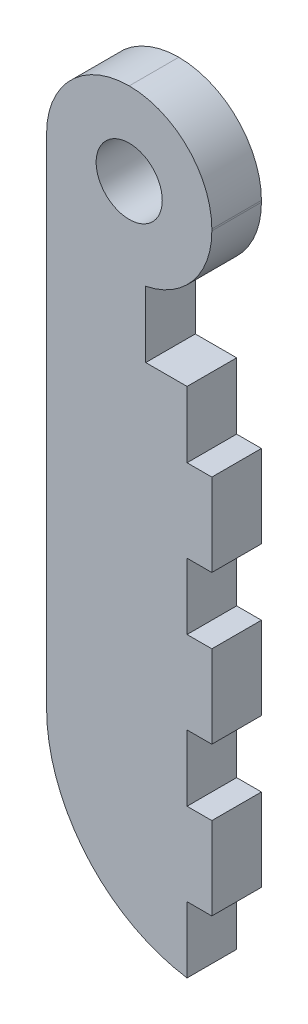
ISO-10303-21;
HEADER;
FILE_DESCRIPTION(('STEP AP214'),'2;1');
FILE_NAME('part.step','',(''),(''),'','','');
FILE_SCHEMA(('AUTOMOTIVE_DESIGN { 1 0 10303 214 1 1 1 1 }'));
ENDSEC;
DATA;
#1=APPLICATION_CONTEXT('core data for automotive mechanical design processes');
#2=APPLICATION_PROTOCOL_DEFINITION('international standard','automotive_design',2000,#1);
#3=PRODUCT_CONTEXT('',#1,'mechanical');
#4=PRODUCT('Part','Part','',(#3));
#5=PRODUCT_RELATED_PRODUCT_CATEGORY('part','',(#4));
#6=PRODUCT_DEFINITION_FORMATION('','',#4);
#7=PRODUCT_DEFINITION_CONTEXT('part definition',#1,'design');
#8=PRODUCT_DEFINITION('design','',#6,#7);
#9=PRODUCT_DEFINITION_SHAPE('','',#8);
#10=(LENGTH_UNIT() NAMED_UNIT(*) SI_UNIT(.MILLI.,.METRE.));
#11=(NAMED_UNIT(*) PLANE_ANGLE_UNIT() SI_UNIT($,.RADIAN.));
#12=(NAMED_UNIT(*) SI_UNIT($,.STERADIAN.) SOLID_ANGLE_UNIT());
#13=UNCERTAINTY_MEASURE_WITH_UNIT(LENGTH_MEASURE(1.E-05),#10,'distance_accuracy_value','');
#14=(GEOMETRIC_REPRESENTATION_CONTEXT(3) GLOBAL_UNCERTAINTY_ASSIGNED_CONTEXT((#13)) GLOBAL_UNIT_ASSIGNED_CONTEXT((#10,
#11,#12)) REPRESENTATION_CONTEXT('',''));
#15=CARTESIAN_POINT('',(0.,0.,0.));
#16=DIRECTION('',(0.,0.,1.));
#17=DIRECTION('',(1.,0.,0.));
#18=AXIS2_PLACEMENT_3D('',#15,#16,#17);
#19=CARTESIAN_POINT('',(-3.,0.,6.));
#20=DIRECTION('',(1.,0.,0.));
#21=DIRECTION('',(0.,0.,-1.));
#22=AXIS2_PLACEMENT_3D('',#19,#20,#21);
#23=PLANE('',#22);
#24=DIRECTION('',(0.,-1.,0.));
#25=VECTOR('',#24,1.);
#26=CARTESIAN_POINT('',(-3.,0.,0.));
#27=LINE('',#26,#25);
#28=CARTESIAN_POINT('',(-3.,62.,0.));
#29=VERTEX_POINT('',#28);
#30=CARTESIAN_POINT('',(-3.,54.,0.));
#31=VERTEX_POINT('',#30);
#32=EDGE_CURVE('E253',#29,#31,#27,.T.);
#33=ORIENTED_EDGE('',*,*,#32,.F.);
#34=DIRECTION('',(0.,0.,-1.));
#35=VECTOR('',#34,1.);
#36=CARTESIAN_POINT('',(-3.,62.,6.));
#37=LINE('',#36,#35);
#38=CARTESIAN_POINT('',(-3.,62.,6.));
#39=VERTEX_POINT('',#38);
#40=EDGE_CURVE('E183',#39,#29,#37,.T.);
#41=ORIENTED_EDGE('',*,*,#40,.F.);
#42=DIRECTION('',(0.,-1.,0.));
#43=VECTOR('',#42,1.);
#44=CARTESIAN_POINT('',(-3.,0.,6.));
#45=LINE('',#44,#43);
#46=CARTESIAN_POINT('',(-3.,54.,6.));
#47=VERTEX_POINT('',#46);
#48=EDGE_CURVE('E214',#39,#47,#45,.T.);
#49=ORIENTED_EDGE('',*,*,#48,.T.);
#50=DIRECTION('',(0.,0.,-1.));
#51=VECTOR('',#50,1.);
#52=CARTESIAN_POINT('',(-3.,54.,6.));
#53=LINE('',#52,#51);
#54=EDGE_CURVE('E250',#47,#31,#53,.T.);
#55=ORIENTED_EDGE('',*,*,#54,.T.);
#56=EDGE_LOOP('',(#33,#41,#49,#55));
#57=FACE_BOUND('',#56,.T.);
#58=ADVANCED_FACE('F37',(#57),#23,.T.);
#59=CARTESIAN_POINT('',(0.,0.,6.));
#60=DIRECTION('',(-1.,0.,0.));
#61=DIRECTION('',(0.,0.,1.));
#62=AXIS2_PLACEMENT_3D('',#59,#60,#61);
#63=PLANE('',#62);
#64=DIRECTION('',(0.,1.,0.));
#65=VECTOR('',#64,1.);
#66=CARTESIAN_POINT('',(0.,0.,6.));
#67=LINE('',#66,#65);
#68=CARTESIAN_POINT('',(0.,79.7979589711327,6.));
#69=VERTEX_POINT('',#68);
#70=CARTESIAN_POINT('',(0.,80.,6.));
#71=VERTEX_POINT('',#70);
#72=EDGE_CURVE('E218',#69,#71,#67,.T.);
#73=ORIENTED_EDGE('',*,*,#72,.F.);
#74=DIRECTION('',(0.,0.,1.));
#75=VECTOR('',#74,1.);
#76=CARTESIAN_POINT('',(0.,79.7979589711327,6.));
#77=LINE('',#76,#75);
#78=CARTESIAN_POINT('',(0.,79.7979589711327,0.));
#79=VERTEX_POINT('',#78);
#80=EDGE_CURVE('E336',#69,#79,#77,.F.);
#81=ORIENTED_EDGE('',*,*,#80,.T.);
#82=DIRECTION('',(0.,1.,0.));
#83=VECTOR('',#82,1.);
#84=CARTESIAN_POINT('',(0.,0.,0.));
#85=LINE('',#84,#83);
#86=CARTESIAN_POINT('',(0.,80.,0.));
#87=VERTEX_POINT('',#86);
#88=EDGE_CURVE('E255',#79,#87,#85,.T.);
#89=ORIENTED_EDGE('',*,*,#88,.T.);
#90=DIRECTION('',(0.,0.,-1.));
#91=VECTOR('',#90,1.);
#92=CARTESIAN_POINT('',(0.,80.,6.));
#93=LINE('',#92,#91);
#94=EDGE_CURVE('E334',#87,#71,#93,.F.);
#95=ORIENTED_EDGE('',*,*,#94,.T.);
#96=EDGE_LOOP('',(#73,#81,#89,#95));
#97=FACE_BOUND('',#96,.T.);
#98=ADVANCED_FACE('F353',(#97),#63,.F.);
#99=CARTESIAN_POINT('',(-20.,0.,6.));
#100=DIRECTION('',(-1.,0.,0.));
#101=DIRECTION('',(0.,0.,1.));
#102=AXIS2_PLACEMENT_3D('',#99,#100,#101);
#103=PLANE('',#102);
#104=DIRECTION('',(0.,1.,0.));
#105=VECTOR('',#104,1.);
#106=CARTESIAN_POINT('',(-20.,0.,0.));
#107=LINE('',#106,#105);
#108=CARTESIAN_POINT('',(-20.,19.7737199332852,0.));
#109=VERTEX_POINT('',#108);
#110=CARTESIAN_POINT('',(-20.,80.,0.));
#111=VERTEX_POINT('',#110);
#112=EDGE_CURVE('E260',#109,#111,#107,.T.);
#113=ORIENTED_EDGE('',*,*,#112,.F.);
#114=DIRECTION('',(0.,0.,-1.));
#115=VECTOR('',#114,1.);
#116=CARTESIAN_POINT('',(-20.,19.7737199332852,6.));
#117=LINE('',#116,#115);
#118=CARTESIAN_POINT('',(-20.,19.7737199332852,6.));
#119=VERTEX_POINT('',#118);
#120=EDGE_CURVE('E45',#109,#119,#117,.F.);
#121=ORIENTED_EDGE('',*,*,#120,.T.);
#122=DIRECTION('',(0.,1.,0.));
#123=VECTOR('',#122,1.);
#124=CARTESIAN_POINT('',(-20.,0.,6.));
#125=LINE('',#124,#123);
#126=CARTESIAN_POINT('',(-20.,80.,6.));
#127=VERTEX_POINT('',#126);
#128=EDGE_CURVE('E223',#119,#127,#125,.T.);
#129=ORIENTED_EDGE('',*,*,#128,.T.);
#130=DIRECTION('',(0.,0.,-1.));
#131=VECTOR('',#130,1.);
#132=CARTESIAN_POINT('',(-20.,80.,0.));
#133=LINE('',#132,#131);
#134=EDGE_CURVE('E319',#127,#111,#133,.T.);
#135=ORIENTED_EDGE('',*,*,#134,.T.);
#136=EDGE_LOOP('',(#113,#121,#129,#135));
#137=FACE_BOUND('',#136,.T.);
#138=ADVANCED_FACE('F391',(#137),#103,.T.);
#139=CARTESIAN_POINT('',(-3.,8.,0.));
#140=VERTEX_POINT('',#139);
#141=CARTESIAN_POINT('',(-3.,0.,0.));
#142=VERTEX_POINT('',#141);
#143=EDGE_CURVE('E257',#140,#142,#27,.T.);
#144=ORIENTED_EDGE('',*,*,#143,.F.);
#145=DIRECTION('',(0.,0.,-1.));
#146=VECTOR('',#145,1.);
#147=CARTESIAN_POINT('',(-3.,8.,6.));
#148=LINE('',#147,#146);
#149=CARTESIAN_POINT('',(-3.,8.,6.));
#150=VERTEX_POINT('',#149);
#151=EDGE_CURVE('E313',#150,#140,#148,.T.);
#152=ORIENTED_EDGE('',*,*,#151,.F.);
#153=CARTESIAN_POINT('',(-3.,0.,6.));
#154=VERTEX_POINT('',#153);
#155=EDGE_CURVE('E220',#150,#154,#45,.T.);
#156=ORIENTED_EDGE('',*,*,#155,.T.);
#157=DIRECTION('',(0.,0.,-1.));
#158=VECTOR('',#157,1.);
#159=CARTESIAN_POINT('',(-3.,0.,6.));
#160=LINE('',#159,#158);
#161=EDGE_CURVE('E315',#154,#142,#160,.T.);
#162=ORIENTED_EDGE('',*,*,#161,.T.);
#163=EDGE_LOOP('',(#144,#152,#156,#162));
#164=FACE_BOUND('',#163,.T.);
#165=ADVANCED_FACE('F384',(#164),#23,.T.);
#166=CARTESIAN_POINT('',(0.,8.,6.));
#167=DIRECTION('',(0.,-1.,0.));
#168=DIRECTION('',(0.,0.,-1.));
#169=AXIS2_PLACEMENT_3D('',#166,#167,#168);
#170=PLANE('',#169);
#171=DIRECTION('',(-1.,0.,0.));
#172=VECTOR('',#171,1.);
#173=CARTESIAN_POINT('',(0.,8.,0.));
#174=LINE('',#173,#172);
#175=CARTESIAN_POINT('',(0.,8.,0.));
#176=VERTEX_POINT('',#175);
#177=EDGE_CURVE('E262',#176,#140,#174,.T.);
#178=ORIENTED_EDGE('',*,*,#177,.F.);
#179=DIRECTION('',(0.,0.,-1.));
#180=VECTOR('',#179,1.);
#181=CARTESIAN_POINT('',(0.,8.,6.));
#182=LINE('',#181,#180);
#183=CARTESIAN_POINT('',(0.,8.,6.));
#184=VERTEX_POINT('',#183);
#185=EDGE_CURVE('E311',#184,#176,#182,.T.);
#186=ORIENTED_EDGE('',*,*,#185,.F.);
#187=DIRECTION('',(-1.,0.,0.));
#188=VECTOR('',#187,1.);
#189=CARTESIAN_POINT('',(0.,8.,6.));
#190=LINE('',#189,#188);
#191=EDGE_CURVE('E225',#184,#150,#190,.T.);
#192=ORIENTED_EDGE('',*,*,#191,.T.);
#193=ORIENTED_EDGE('',*,*,#151,.T.);
#194=EDGE_LOOP('',(#178,#186,#192,#193));
#195=FACE_BOUND('',#194,.T.);
#196=ADVANCED_FACE('F398',(#195),#170,.T.);
#197=CARTESIAN_POINT('',(0.,0.,6.));
#198=DIRECTION('',(-1.,0.,0.));
#199=DIRECTION('',(0.,0.,1.));
#200=AXIS2_PLACEMENT_3D('',#197,#198,#199);
#201=PLANE('',#200);
#202=DIRECTION('',(0.,1.,0.));
#203=VECTOR('',#202,1.);
#204=CARTESIAN_POINT('',(0.,0.,0.));
#205=LINE('',#204,#203);
#206=CARTESIAN_POINT('',(0.,18.,0.));
#207=VERTEX_POINT('',#206);
#208=EDGE_CURVE('E265',#176,#207,#205,.T.);
#209=ORIENTED_EDGE('',*,*,#208,.T.);
#210=DIRECTION('',(0.,0.,-1.));
#211=VECTOR('',#210,1.);
#212=CARTESIAN_POINT('',(0.,18.,6.));
#213=LINE('',#212,#211);
#214=CARTESIAN_POINT('',(0.,18.,6.));
#215=VERTEX_POINT('',#214);
#216=EDGE_CURVE('E308',#215,#207,#213,.T.);
#217=ORIENTED_EDGE('',*,*,#216,.F.);
#218=DIRECTION('',(0.,1.,0.));
#219=VECTOR('',#218,1.);
#220=CARTESIAN_POINT('',(0.,0.,6.));
#221=LINE('',#220,#219);
#222=EDGE_CURVE('E228',#184,#215,#221,.T.);
#223=ORIENTED_EDGE('',*,*,#222,.F.);
#224=ORIENTED_EDGE('',*,*,#185,.T.);
#225=EDGE_LOOP('',(#209,#217,#223,#224));
#226=FACE_BOUND('',#225,.T.);
#227=ADVANCED_FACE('F427',(#226),#201,.F.);
#228=CARTESIAN_POINT('',(0.,18.,6.));
#229=DIRECTION('',(0.,-1.,0.));
#230=DIRECTION('',(0.,0.,-1.));
#231=AXIS2_PLACEMENT_3D('',#228,#229,#230);
#232=PLANE('',#231);
#233=DIRECTION('',(-1.,0.,0.));
#234=VECTOR('',#233,1.);
#235=CARTESIAN_POINT('',(0.,18.,0.));
#236=LINE('',#235,#234);
#237=CARTESIAN_POINT('',(-3.,18.,0.));
#238=VERTEX_POINT('',#237);
#239=EDGE_CURVE('E268',#207,#238,#236,.T.);
#240=ORIENTED_EDGE('',*,*,#239,.T.);
#241=DIRECTION('',(0.,0.,-1.));
#242=VECTOR('',#241,1.);
#243=CARTESIAN_POINT('',(-3.,18.,6.));
#244=LINE('',#243,#242);
#245=CARTESIAN_POINT('',(-3.,18.,6.));
#246=VERTEX_POINT('',#245);
#247=EDGE_CURVE('E306',#246,#238,#244,.T.);
#248=ORIENTED_EDGE('',*,*,#247,.F.);
#249=DIRECTION('',(-1.,0.,0.));
#250=VECTOR('',#249,1.);
#251=CARTESIAN_POINT('',(0.,18.,6.));
#252=LINE('',#251,#250);
#253=EDGE_CURVE('E231',#215,#246,#252,.T.);
#254=ORIENTED_EDGE('',*,*,#253,.F.);
#255=ORIENTED_EDGE('',*,*,#216,.T.);
#256=EDGE_LOOP('',(#240,#248,#254,#255));
#257=FACE_BOUND('',#256,.T.);
#258=ADVANCED_FACE('F419',(#257),#232,.F.);
#259=CARTESIAN_POINT('',(-3.,26.,0.));
#260=VERTEX_POINT('',#259);
#261=EDGE_CURVE('E271',#260,#238,#27,.T.);
#262=ORIENTED_EDGE('',*,*,#261,.F.);
#263=DIRECTION('',(0.,0.,-1.));
#264=VECTOR('',#263,1.);
#265=CARTESIAN_POINT('',(-3.,26.,6.));
#266=LINE('',#265,#264);
#267=CARTESIAN_POINT('',(-3.,26.,6.));
#268=VERTEX_POINT('',#267);
#269=EDGE_CURVE('E304',#268,#260,#266,.T.);
#270=ORIENTED_EDGE('',*,*,#269,.F.);
#271=EDGE_CURVE('E233',#268,#246,#45,.T.);
#272=ORIENTED_EDGE('',*,*,#271,.T.);
#273=ORIENTED_EDGE('',*,*,#247,.T.);
#274=EDGE_LOOP('',(#262,#270,#272,#273));
#275=FACE_BOUND('',#274,.T.);
#276=ADVANCED_FACE('F400',(#275),#23,.T.);
#277=CARTESIAN_POINT('',(0.,26.,6.));
#278=DIRECTION('',(0.,-1.,0.));
#279=DIRECTION('',(0.,0.,-1.));
#280=AXIS2_PLACEMENT_3D('',#277,#278,#279);
#281=PLANE('',#280);
#282=DIRECTION('',(-1.,0.,0.));
#283=VECTOR('',#282,1.);
#284=CARTESIAN_POINT('',(0.,26.,0.));
#285=LINE('',#284,#283);
#286=CARTESIAN_POINT('',(0.,26.,0.));
#287=VERTEX_POINT('',#286);
#288=EDGE_CURVE('E272',#287,#260,#285,.T.);
#289=ORIENTED_EDGE('',*,*,#288,.F.);
#290=DIRECTION('',(0.,0.,-1.));
#291=VECTOR('',#290,1.);
#292=CARTESIAN_POINT('',(0.,26.,6.));
#293=LINE('',#292,#291);
#294=CARTESIAN_POINT('',(0.,26.,6.));
#295=VERTEX_POINT('',#294);
#296=EDGE_CURVE('E302',#295,#287,#293,.T.);
#297=ORIENTED_EDGE('',*,*,#296,.F.);
#298=DIRECTION('',(-1.,0.,0.));
#299=VECTOR('',#298,1.);
#300=CARTESIAN_POINT('',(0.,26.,6.));
#301=LINE('',#300,#299);
#302=EDGE_CURVE('E234',#295,#268,#301,.T.);
#303=ORIENTED_EDGE('',*,*,#302,.T.);
#304=ORIENTED_EDGE('',*,*,#269,.T.);
#305=EDGE_LOOP('',(#289,#297,#303,#304));
#306=FACE_BOUND('',#305,.T.);
#307=ADVANCED_FACE('F418',(#306),#281,.T.);
#308=CARTESIAN_POINT('',(0.,0.,6.));
#309=DIRECTION('',(-1.,0.,0.));
#310=DIRECTION('',(0.,0.,1.));
#311=AXIS2_PLACEMENT_3D('',#308,#309,#310);
#312=PLANE('',#311);
#313=DIRECTION('',(0.,1.,0.));
#314=VECTOR('',#313,1.);
#315=CARTESIAN_POINT('',(0.,0.,0.));
#316=LINE('',#315,#314);
#317=CARTESIAN_POINT('',(0.,36.,0.));
#318=VERTEX_POINT('',#317);
#319=EDGE_CURVE('E275',#287,#318,#316,.T.);
#320=ORIENTED_EDGE('',*,*,#319,.T.);
#321=DIRECTION('',(0.,0.,-1.));
#322=VECTOR('',#321,1.);
#323=CARTESIAN_POINT('',(0.,36.,6.));
#324=LINE('',#323,#322);
#325=CARTESIAN_POINT('',(0.,36.,6.));
#326=VERTEX_POINT('',#325);
#327=EDGE_CURVE('E299',#326,#318,#324,.T.);
#328=ORIENTED_EDGE('',*,*,#327,.F.);
#329=DIRECTION('',(0.,1.,0.));
#330=VECTOR('',#329,1.);
#331=CARTESIAN_POINT('',(0.,0.,6.));
#332=LINE('',#331,#330);
#333=EDGE_CURVE('E237',#295,#326,#332,.T.);
#334=ORIENTED_EDGE('',*,*,#333,.F.);
#335=ORIENTED_EDGE('',*,*,#296,.T.);
#336=EDGE_LOOP('',(#320,#328,#334,#335));
#337=FACE_BOUND('',#336,.T.);
#338=ADVANCED_FACE('F415',(#337),#312,.F.);
#339=CARTESIAN_POINT('',(0.,36.,6.));
#340=DIRECTION('',(0.,-1.,0.));
#341=DIRECTION('',(0.,0.,-1.));
#342=AXIS2_PLACEMENT_3D('',#339,#340,#341);
#343=PLANE('',#342);
#344=DIRECTION('',(-1.,0.,0.));
#345=VECTOR('',#344,1.);
#346=CARTESIAN_POINT('',(0.,36.,0.));
#347=LINE('',#346,#345);
#348=CARTESIAN_POINT('',(-3.,36.,0.));
#349=VERTEX_POINT('',#348);
#350=EDGE_CURVE('E278',#318,#349,#347,.T.);
#351=ORIENTED_EDGE('',*,*,#350,.T.);
#352=DIRECTION('',(0.,0.,-1.));
#353=VECTOR('',#352,1.);
#354=CARTESIAN_POINT('',(-3.,36.,6.));
#355=LINE('',#354,#353);
#356=CARTESIAN_POINT('',(-3.,36.,6.));
#357=VERTEX_POINT('',#356);
#358=EDGE_CURVE('E297',#357,#349,#355,.T.);
#359=ORIENTED_EDGE('',*,*,#358,.F.);
#360=DIRECTION('',(-1.,0.,0.));
#361=VECTOR('',#360,1.);
#362=CARTESIAN_POINT('',(0.,36.,6.));
#363=LINE('',#362,#361);
#364=EDGE_CURVE('E240',#326,#357,#363,.T.);
#365=ORIENTED_EDGE('',*,*,#364,.F.);
#366=ORIENTED_EDGE('',*,*,#327,.T.);
#367=EDGE_LOOP('',(#351,#359,#365,#366));
#368=FACE_BOUND('',#367,.T.);
#369=ADVANCED_FACE('F410',(#368),#343,.F.);
#370=CARTESIAN_POINT('',(-3.,44.,0.));
#371=VERTEX_POINT('',#370);
#372=EDGE_CURVE('E256',#371,#349,#27,.T.);
#373=ORIENTED_EDGE('',*,*,#372,.F.);
#374=DIRECTION('',(0.,0.,-1.));
#375=VECTOR('',#374,1.);
#376=CARTESIAN_POINT('',(-3.,44.,6.));
#377=LINE('',#376,#375);
#378=CARTESIAN_POINT('',(-3.,44.,6.));
#379=VERTEX_POINT('',#378);
#380=EDGE_CURVE('E295',#379,#371,#377,.T.);
#381=ORIENTED_EDGE('',*,*,#380,.F.);
#382=EDGE_CURVE('E219',#379,#357,#45,.T.);
#383=ORIENTED_EDGE('',*,*,#382,.T.);
#384=ORIENTED_EDGE('',*,*,#358,.T.);
#385=EDGE_LOOP('',(#373,#381,#383,#384));
#386=FACE_BOUND('',#385,.T.);
#387=ADVANCED_FACE('F404',(#386),#23,.T.);
#388=CARTESIAN_POINT('',(0.,44.,6.));
#389=DIRECTION('',(0.,-1.,0.));
#390=DIRECTION('',(0.,0.,-1.));
#391=AXIS2_PLACEMENT_3D('',#388,#389,#390);
#392=PLANE('',#391);
#393=DIRECTION('',(-1.,0.,0.));
#394=VECTOR('',#393,1.);
#395=CARTESIAN_POINT('',(0.,44.,0.));
#396=LINE('',#395,#394);
#397=CARTESIAN_POINT('',(0.,44.,0.));
#398=VERTEX_POINT('',#397);
#399=EDGE_CURVE('E281',#398,#371,#396,.T.);
#400=ORIENTED_EDGE('',*,*,#399,.F.);
#401=DIRECTION('',(0.,0.,-1.));
#402=VECTOR('',#401,1.);
#403=CARTESIAN_POINT('',(0.,44.,6.));
#404=LINE('',#403,#402);
#405=CARTESIAN_POINT('',(0.,44.,6.));
#406=VERTEX_POINT('',#405);
#407=EDGE_CURVE('E293',#406,#398,#404,.T.);
#408=ORIENTED_EDGE('',*,*,#407,.F.);
#409=DIRECTION('',(-1.,0.,0.));
#410=VECTOR('',#409,1.);
#411=CARTESIAN_POINT('',(0.,44.,6.));
#412=LINE('',#411,#410);
#413=EDGE_CURVE('E242',#406,#379,#412,.T.);
#414=ORIENTED_EDGE('',*,*,#413,.T.);
#415=ORIENTED_EDGE('',*,*,#380,.T.);
#416=EDGE_LOOP('',(#400,#408,#414,#415));
#417=FACE_BOUND('',#416,.T.);
#418=ADVANCED_FACE('F373',(#417),#392,.T.);
#419=CARTESIAN_POINT('',(0.,0.,6.));
#420=DIRECTION('',(-1.,0.,0.));
#421=DIRECTION('',(0.,0.,1.));
#422=AXIS2_PLACEMENT_3D('',#419,#420,#421);
#423=PLANE('',#422);
#424=DIRECTION('',(0.,1.,0.));
#425=VECTOR('',#424,1.);
#426=CARTESIAN_POINT('',(0.,0.,0.));
#427=LINE('',#426,#425);
#428=CARTESIAN_POINT('',(0.,54.,0.));
#429=VERTEX_POINT('',#428);
#430=EDGE_CURVE('E284',#398,#429,#427,.T.);
#431=ORIENTED_EDGE('',*,*,#430,.T.);
#432=DIRECTION('',(0.,0.,-1.));
#433=VECTOR('',#432,1.);
#434=CARTESIAN_POINT('',(0.,54.,6.));
#435=LINE('',#434,#433);
#436=CARTESIAN_POINT('',(0.,54.,6.));
#437=VERTEX_POINT('',#436);
#438=EDGE_CURVE('E290',#437,#429,#435,.T.);
#439=ORIENTED_EDGE('',*,*,#438,.F.);
#440=DIRECTION('',(0.,1.,0.));
#441=VECTOR('',#440,1.);
#442=CARTESIAN_POINT('',(0.,0.,6.));
#443=LINE('',#442,#441);
#444=EDGE_CURVE('E245',#406,#437,#443,.T.);
#445=ORIENTED_EDGE('',*,*,#444,.F.);
#446=ORIENTED_EDGE('',*,*,#407,.T.);
#447=EDGE_LOOP('',(#431,#439,#445,#446));
#448=FACE_BOUND('',#447,.T.);
#449=ADVANCED_FACE('F370',(#448),#423,.F.);
#450=CARTESIAN_POINT('',(-10.,80.,6.));
#451=DIRECTION('',(0.,0.,-1.));
#452=DIRECTION('',(-1.,0.,0.));
#453=AXIS2_PLACEMENT_3D('',#450,#451,#452);
#454=CYLINDRICAL_SURFACE('',#453,4.);
#455=CARTESIAN_POINT('',(-10.,80.,6.));
#456=DIRECTION('',(0.,0.,1.));
#457=DIRECTION('',(1.,0.,0.));
#458=AXIS2_PLACEMENT_3D('',#455,#456,#457);
#459=CIRCLE('',#458,4.);
#460=CARTESIAN_POINT('',(-6.,80.,6.));
#461=VERTEX_POINT('',#460);
#462=EDGE_CURVE('E211',#461,#461,#459,.T.);
#463=ORIENTED_EDGE('',*,*,#462,.T.);
#464=EDGE_LOOP('',(#463));
#465=FACE_BOUND('',#464,.T.);
#466=CARTESIAN_POINT('',(-10.,80.,0.));
#467=DIRECTION('',(0.,0.,1.));
#468=DIRECTION('',(1.,0.,0.));
#469=AXIS2_PLACEMENT_3D('',#466,#467,#468);
#470=CIRCLE('',#469,4.);
#471=CARTESIAN_POINT('',(-6.,80.,0.));
#472=VERTEX_POINT('',#471);
#473=EDGE_CURVE('E198',#472,#472,#470,.T.);
#474=ORIENTED_EDGE('',*,*,#473,.F.);
#475=EDGE_LOOP('',(#474));
#476=FACE_BOUND('',#475,.T.);
#477=ADVANCED_FACE('F507',(#465,#476),#454,.F.);
#478=CARTESIAN_POINT('',(0.,54.,6.));
#479=DIRECTION('',(0.,-1.,0.));
#480=DIRECTION('',(0.,0.,-1.));
#481=AXIS2_PLACEMENT_3D('',#478,#479,#480);
#482=PLANE('',#481);
#483=DIRECTION('',(-1.,0.,0.));
#484=VECTOR('',#483,1.);
#485=CARTESIAN_POINT('',(0.,54.,0.));
#486=LINE('',#485,#484);
#487=EDGE_CURVE('E215',#429,#31,#486,.T.);
#488=ORIENTED_EDGE('',*,*,#487,.T.);
#489=ORIENTED_EDGE('',*,*,#54,.F.);
#490=DIRECTION('',(-1.,0.,0.));
#491=VECTOR('',#490,1.);
#492=CARTESIAN_POINT('',(0.,54.,6.));
#493=LINE('',#492,#491);
#494=EDGE_CURVE('E248',#437,#47,#493,.T.);
#495=ORIENTED_EDGE('',*,*,#494,.F.);
#496=ORIENTED_EDGE('',*,*,#438,.T.);
#497=EDGE_LOOP('',(#488,#489,#495,#496));
#498=FACE_BOUND('',#497,.T.);
#499=ADVANCED_FACE('F367',(#498),#482,.F.);
#500=CARTESIAN_POINT('',(0.,0.,6.));
#501=DIRECTION('',(0.,0.,1.));
#502=DIRECTION('',(1.,0.,0.));
#503=AXIS2_PLACEMENT_3D('',#500,#501,#502);
#504=PLANE('',#503);
#505=ORIENTED_EDGE('',*,*,#128,.F.);
#506=CARTESIAN_POINT('',(0.,19.7737199332852,6.));
#507=DIRECTION('',(0.,0.,1.));
#508=DIRECTION('',(1.,0.,0.));
#509=AXIS2_PLACEMENT_3D('',#506,#507,#508);
#510=CIRCLE('',#509,20.);
#511=EDGE_CURVE('E11',#119,#154,#510,.T.);
#512=ORIENTED_EDGE('',*,*,#511,.T.);
#513=ORIENTED_EDGE('',*,*,#155,.F.);
#514=ORIENTED_EDGE('',*,*,#191,.F.);
#515=ORIENTED_EDGE('',*,*,#222,.T.);
#516=ORIENTED_EDGE('',*,*,#253,.T.);
#517=ORIENTED_EDGE('',*,*,#271,.F.);
#518=ORIENTED_EDGE('',*,*,#302,.F.);
#519=ORIENTED_EDGE('',*,*,#333,.T.);
#520=ORIENTED_EDGE('',*,*,#364,.T.);
#521=ORIENTED_EDGE('',*,*,#382,.F.);
#522=ORIENTED_EDGE('',*,*,#413,.F.);
#523=ORIENTED_EDGE('',*,*,#444,.T.);
#524=ORIENTED_EDGE('',*,*,#494,.T.);
#525=ORIENTED_EDGE('',*,*,#48,.F.);
#526=DIRECTION('',(1.,0.,0.));
#527=VECTOR('',#526,1.);
#528=CARTESIAN_POINT('',(-3.,62.,6.));
#529=LINE('',#528,#527);
#530=CARTESIAN_POINT('',(-8.,62.,6.));
#531=VERTEX_POINT('',#530);
#532=EDGE_CURVE('E188',#531,#39,#529,.T.);
#533=ORIENTED_EDGE('',*,*,#532,.F.);
#534=DIRECTION('',(0.,-1.,0.));
#535=VECTOR('',#534,1.);
#536=CARTESIAN_POINT('',(-8.,62.,6.));
#537=LINE('',#536,#535);
#538=CARTESIAN_POINT('',(-8.,70.,6.));
#539=VERTEX_POINT('',#538);
#540=EDGE_CURVE('E196',#539,#531,#537,.T.);
#541=ORIENTED_EDGE('',*,*,#540,.F.);
#542=CARTESIAN_POINT('',(-10.,79.7979589711327,6.));
#543=DIRECTION('',(0.,0.,1.));
#544=DIRECTION('',(1.,0.,0.));
#545=AXIS2_PLACEMENT_3D('',#542,#543,#544);
#546=CIRCLE('',#545,10.);
#547=EDGE_CURVE('E332',#539,#69,#546,.T.);
#548=ORIENTED_EDGE('',*,*,#547,.T.);
#549=ORIENTED_EDGE('',*,*,#72,.T.);
#550=CARTESIAN_POINT('',(-10.,80.,6.));
#551=DIRECTION('',(0.,0.,1.));
#552=DIRECTION('',(1.,0.,0.));
#553=AXIS2_PLACEMENT_3D('',#550,#551,#552);
#554=CIRCLE('',#553,10.);
#555=CARTESIAN_POINT('',(-10.,90.,6.));
#556=VERTEX_POINT('',#555);
#557=EDGE_CURVE('E327',#71,#556,#554,.T.);
#558=ORIENTED_EDGE('',*,*,#557,.T.);
#559=CARTESIAN_POINT('',(-10.,80.,6.));
#560=DIRECTION('',(0.,0.,1.));
#561=DIRECTION('',(1.,0.,0.));
#562=AXIS2_PLACEMENT_3D('',#559,#560,#561);
#563=CIRCLE('',#562,10.);
#564=EDGE_CURVE('E329',#556,#127,#563,.T.);
#565=ORIENTED_EDGE('',*,*,#564,.T.);
#566=EDGE_LOOP('',(#505,#512,#513,#514,#515,#516,#517,#518,#519,#520,#521,#522,#523,#524,#525,
#533,#541,#548,#549,#558,#565));
#567=FACE_BOUND('',#566,.T.);
#568=ORIENTED_EDGE('',*,*,#462,.F.);
#569=EDGE_LOOP('',(#568));
#570=FACE_BOUND('',#569,.T.);
#571=ADVANCED_FACE('F358',(#567,#570),#504,.T.);
#572=CARTESIAN_POINT('',(0.,0.,0.));
#573=DIRECTION('',(0.,0.,1.));
#574=DIRECTION('',(1.,0.,0.));
#575=AXIS2_PLACEMENT_3D('',#572,#573,#574);
#576=PLANE('',#575);
#577=ORIENTED_EDGE('',*,*,#473,.T.);
#578=EDGE_LOOP('',(#577));
#579=FACE_BOUND('',#578,.T.);
#580=ORIENTED_EDGE('',*,*,#143,.T.);
#581=CARTESIAN_POINT('',(0.,19.7737199332852,0.));
#582=DIRECTION('',(0.,0.,1.));
#583=DIRECTION('',(1.,0.,0.));
#584=AXIS2_PLACEMENT_3D('',#581,#582,#583);
#585=CIRCLE('',#584,20.);
#586=EDGE_CURVE('E59',#142,#109,#585,.F.);
#587=ORIENTED_EDGE('',*,*,#586,.T.);
#588=ORIENTED_EDGE('',*,*,#112,.T.);
#589=CARTESIAN_POINT('',(-10.,80.,0.));
#590=DIRECTION('',(0.,0.,1.));
#591=DIRECTION('',(1.,0.,0.));
#592=AXIS2_PLACEMENT_3D('',#589,#590,#591);
#593=CIRCLE('',#592,10.);
#594=CARTESIAN_POINT('',(-10.,90.,0.));
#595=VERTEX_POINT('',#594);
#596=EDGE_CURVE('E324',#111,#595,#593,.F.);
#597=ORIENTED_EDGE('',*,*,#596,.T.);
#598=CARTESIAN_POINT('',(-10.,80.,0.));
#599=DIRECTION('',(0.,0.,1.));
#600=DIRECTION('',(1.,0.,0.));
#601=AXIS2_PLACEMENT_3D('',#598,#599,#600);
#602=CIRCLE('',#601,10.);
#603=EDGE_CURVE('E322',#595,#87,#602,.F.);
#604=ORIENTED_EDGE('',*,*,#603,.T.);
#605=ORIENTED_EDGE('',*,*,#88,.F.);
#606=CARTESIAN_POINT('',(-10.,79.7979589711327,0.));
#607=DIRECTION('',(0.,0.,1.));
#608=DIRECTION('',(1.,0.,0.));
#609=AXIS2_PLACEMENT_3D('',#606,#607,#608);
#610=CIRCLE('',#609,10.);
#611=CARTESIAN_POINT('',(-8.,70.,0.));
#612=VERTEX_POINT('',#611);
#613=EDGE_CURVE('E204',#79,#612,#610,.F.);
#614=ORIENTED_EDGE('',*,*,#613,.T.);
#615=DIRECTION('',(0.,-1.,0.));
#616=VECTOR('',#615,1.);
#617=CARTESIAN_POINT('',(-8.,62.,0.));
#618=LINE('',#617,#616);
#619=CARTESIAN_POINT('',(-8.,62.,0.));
#620=VERTEX_POINT('',#619);
#621=EDGE_CURVE('E187',#612,#620,#618,.T.);
#622=ORIENTED_EDGE('',*,*,#621,.T.);
#623=DIRECTION('',(1.,0.,0.));
#624=VECTOR('',#623,1.);
#625=CARTESIAN_POINT('',(0.,62.,0.));
#626=LINE('',#625,#624);
#627=EDGE_CURVE('E177',#620,#29,#626,.T.);
#628=ORIENTED_EDGE('',*,*,#627,.T.);
#629=ORIENTED_EDGE('',*,*,#32,.T.);
#630=ORIENTED_EDGE('',*,*,#487,.F.);
#631=ORIENTED_EDGE('',*,*,#430,.F.);
#632=ORIENTED_EDGE('',*,*,#399,.T.);
#633=ORIENTED_EDGE('',*,*,#372,.T.);
#634=ORIENTED_EDGE('',*,*,#350,.F.);
#635=ORIENTED_EDGE('',*,*,#319,.F.);
#636=ORIENTED_EDGE('',*,*,#288,.T.);
#637=ORIENTED_EDGE('',*,*,#261,.T.);
#638=ORIENTED_EDGE('',*,*,#239,.F.);
#639=ORIENTED_EDGE('',*,*,#208,.F.);
#640=ORIENTED_EDGE('',*,*,#177,.T.);
#641=EDGE_LOOP('',(#580,#587,#588,#597,#604,#605,#614,#622,#628,#629,#630,#631,#632,#633,#634,
#635,#636,#637,#638,#639,#640));
#642=FACE_BOUND('',#641,.T.);
#643=ADVANCED_FACE('F201',(#579,#642),#576,.F.);
#644=CARTESIAN_POINT('',(-3.,62.,0.));
#645=DIRECTION('',(0.,-1.,0.));
#646=DIRECTION('',(0.,0.,-1.));
#647=AXIS2_PLACEMENT_3D('',#644,#645,#646);
#648=PLANE('',#647);
#649=ORIENTED_EDGE('',*,*,#40,.T.);
#650=ORIENTED_EDGE('',*,*,#627,.F.);
#651=DIRECTION('',(0.,0.,1.));
#652=VECTOR('',#651,1.);
#653=CARTESIAN_POINT('',(-8.,62.,0.));
#654=LINE('',#653,#652);
#655=EDGE_CURVE('E180',#620,#531,#654,.T.);
#656=ORIENTED_EDGE('',*,*,#655,.T.);
#657=ORIENTED_EDGE('',*,*,#532,.T.);
#658=EDGE_LOOP('',(#649,#650,#656,#657));
#659=FACE_BOUND('',#658,.T.);
#660=ADVANCED_FACE('F179',(#659),#648,.F.);
#661=CARTESIAN_POINT('',(-8.,62.,0.));
#662=DIRECTION('',(-1.,0.,0.));
#663=DIRECTION('',(0.,0.,1.));
#664=AXIS2_PLACEMENT_3D('',#661,#662,#663);
#665=PLANE('',#664);
#666=ORIENTED_EDGE('',*,*,#540,.T.);
#667=ORIENTED_EDGE('',*,*,#655,.F.);
#668=ORIENTED_EDGE('',*,*,#621,.F.);
#669=DIRECTION('',(0.,0.,1.));
#670=VECTOR('',#669,1.);
#671=CARTESIAN_POINT('',(-8.,70.,0.));
#672=LINE('',#671,#670);
#673=EDGE_CURVE('E199',#612,#539,#672,.T.);
#674=ORIENTED_EDGE('',*,*,#673,.T.);
#675=EDGE_LOOP('',(#666,#667,#668,#674));
#676=FACE_BOUND('',#675,.T.);
#677=ADVANCED_FACE('F192',(#676),#665,.F.);
#678=CARTESIAN_POINT('',(-10.,80.,6.));
#679=DIRECTION('',(0.,0.,-1.));
#680=DIRECTION('',(-1.,0.,0.));
#681=AXIS2_PLACEMENT_3D('',#678,#679,#680);
#682=CYLINDRICAL_SURFACE('',#681,10.);
#683=DIRECTION('',(0.,0.,-1.));
#684=VECTOR('',#683,1.);
#685=CARTESIAN_POINT('',(-10.,90.,6.));
#686=LINE('',#685,#684);
#687=EDGE_CURVE('E209',#556,#595,#686,.T.);
#688=ORIENTED_EDGE('',*,*,#687,.F.);
#689=ORIENTED_EDGE('',*,*,#557,.F.);
#690=ORIENTED_EDGE('',*,*,#94,.F.);
#691=ORIENTED_EDGE('',*,*,#603,.F.);
#692=EDGE_LOOP('',(#688,#689,#690,#691));
#693=FACE_BOUND('',#692,.T.);
#694=ADVANCED_FACE('F349',(#693),#682,.T.);
#695=CARTESIAN_POINT('',(-10.,80.,6.));
#696=DIRECTION('',(0.,0.,1.));
#697=DIRECTION('',(1.,0.,0.));
#698=AXIS2_PLACEMENT_3D('',#695,#696,#697);
#699=CYLINDRICAL_SURFACE('',#698,10.);
#700=ORIENTED_EDGE('',*,*,#564,.F.);
#701=ORIENTED_EDGE('',*,*,#687,.T.);
#702=ORIENTED_EDGE('',*,*,#596,.F.);
#703=ORIENTED_EDGE('',*,*,#134,.F.);
#704=EDGE_LOOP('',(#700,#701,#702,#703));
#705=FACE_BOUND('',#704,.T.);
#706=ADVANCED_FACE('F344',(#705),#699,.T.);
#707=CARTESIAN_POINT('',(-10.,79.7979589711327,0.));
#708=DIRECTION('',(0.,0.,1.));
#709=DIRECTION('',(1.,0.,0.));
#710=AXIS2_PLACEMENT_3D('',#707,#708,#709);
#711=CYLINDRICAL_SURFACE('',#710,10.);
#712=ORIENTED_EDGE('',*,*,#613,.F.);
#713=ORIENTED_EDGE('',*,*,#80,.F.);
#714=ORIENTED_EDGE('',*,*,#547,.F.);
#715=ORIENTED_EDGE('',*,*,#673,.F.);
#716=EDGE_LOOP('',(#712,#713,#714,#715));
#717=FACE_BOUND('',#716,.T.);
#718=ADVANCED_FACE('F356',(#717),#711,.T.);
#719=CARTESIAN_POINT('',(0.,19.7737199332852,6.));
#720=DIRECTION('',(0.,0.,1.));
#721=DIRECTION('',(1.,0.,0.));
#722=AXIS2_PLACEMENT_3D('',#719,#720,#721);
#723=CYLINDRICAL_SURFACE('',#722,20.);
#724=ORIENTED_EDGE('',*,*,#511,.F.);
#725=ORIENTED_EDGE('',*,*,#120,.F.);
#726=ORIENTED_EDGE('',*,*,#586,.F.);
#727=ORIENTED_EDGE('',*,*,#161,.F.);
#728=EDGE_LOOP('',(#724,#725,#726,#727));
#729=FACE_BOUND('',#728,.T.);
#730=ADVANCED_FACE('F39',(#729),#723,.T.);
#731=CLOSED_SHELL('',(#58,#98,#138,#165,#196,#227,#258,#276,#307,#338,#369,#387,#418,#449,#477,
#499,#571,#643,#660,#677,#694,#706,#718,#730));
#732=MANIFOLD_SOLID_BREP('B2',#731);
#733=ADVANCED_BREP_SHAPE_REPRESENTATION('',(#18,#732),#14);
#734=SHAPE_DEFINITION_REPRESENTATION(#9,#733);
ENDSEC;
END-ISO-10303-21;
